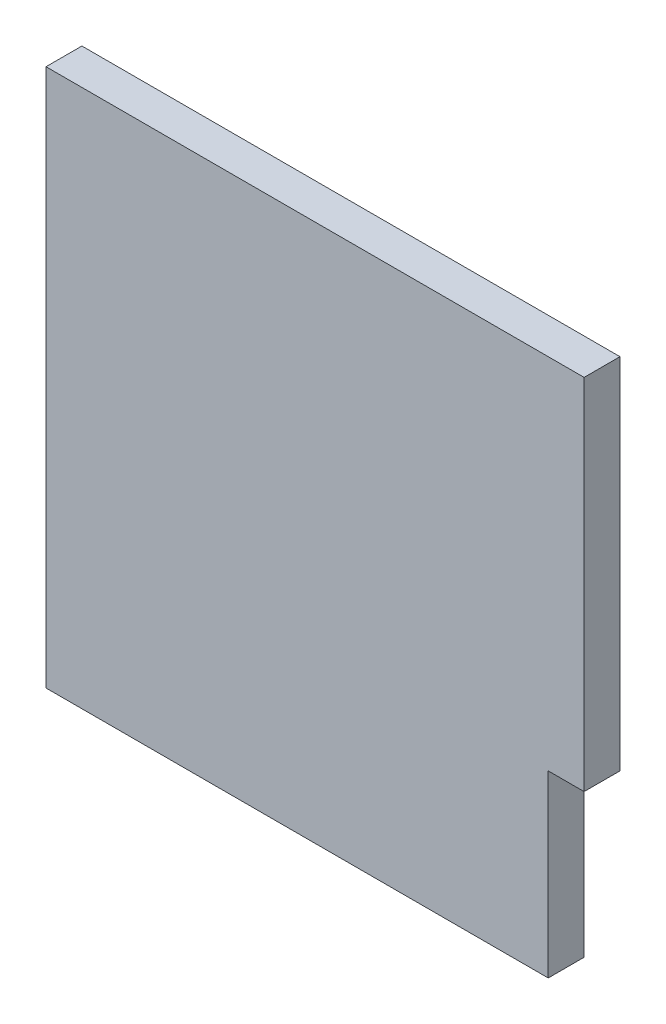
ISO-10303-21;
HEADER;
FILE_DESCRIPTION(('STEP AP214'),'2;1');
FILE_NAME('part.step','',(''),(''),'','','');
FILE_SCHEMA(('AUTOMOTIVE_DESIGN { 1 0 10303 214 1 1 1 1 }'));
ENDSEC;
DATA;
#1=APPLICATION_CONTEXT('core data for automotive mechanical design processes');
#2=APPLICATION_PROTOCOL_DEFINITION('international standard','automotive_design',2000,#1);
#3=PRODUCT_CONTEXT('',#1,'mechanical');
#4=PRODUCT('Part','Part','',(#3));
#5=PRODUCT_RELATED_PRODUCT_CATEGORY('part','',(#4));
#6=PRODUCT_DEFINITION_FORMATION('','',#4);
#7=PRODUCT_DEFINITION_CONTEXT('part definition',#1,'design');
#8=PRODUCT_DEFINITION('design','',#6,#7);
#9=PRODUCT_DEFINITION_SHAPE('','',#8);
#10=(LENGTH_UNIT() NAMED_UNIT(*) SI_UNIT(.MILLI.,.METRE.));
#11=(NAMED_UNIT(*) PLANE_ANGLE_UNIT() SI_UNIT($,.RADIAN.));
#12=(NAMED_UNIT(*) SI_UNIT($,.STERADIAN.) SOLID_ANGLE_UNIT());
#13=UNCERTAINTY_MEASURE_WITH_UNIT(LENGTH_MEASURE(1.E-05),#10,'distance_accuracy_value','');
#14=(GEOMETRIC_REPRESENTATION_CONTEXT(3) GLOBAL_UNCERTAINTY_ASSIGNED_CONTEXT((#13)) GLOBAL_UNIT_ASSIGNED_CONTEXT((#10,
#11,#12)) REPRESENTATION_CONTEXT('',''));
#15=CARTESIAN_POINT('',(0.,0.,0.));
#16=DIRECTION('',(0.,0.,1.));
#17=DIRECTION('',(1.,0.,0.));
#18=AXIS2_PLACEMENT_3D('',#15,#16,#17);
#19=CARTESIAN_POINT('',(-0.1,0.,0.05));
#20=DIRECTION('',(0.,1.,0.));
#21=DIRECTION('',(0.,0.,1.));
#22=AXIS2_PLACEMENT_3D('',#19,#20,#21);
#23=PLANE('',#22);
#24=DIRECTION('',(1.,0.,0.));
#25=VECTOR('',#24,1.);
#26=CARTESIAN_POINT('',(-0.1,0.,-0.05));
#27=LINE('',#26,#25);
#28=CARTESIAN_POINT('',(-0.1,0.,-0.05));
#29=VERTEX_POINT('',#28);
#30=CARTESIAN_POINT('',(0.,0.,-0.05));
#31=VERTEX_POINT('',#30);
#32=EDGE_CURVE('E128',#29,#31,#27,.T.);
#33=ORIENTED_EDGE('',*,*,#32,.T.);
#34=DIRECTION('',(0.,0.,-1.));
#35=VECTOR('',#34,1.);
#36=CARTESIAN_POINT('',(0.,0.,0.05));
#37=LINE('',#36,#35);
#38=CARTESIAN_POINT('',(0.,0.,0.05));
#39=VERTEX_POINT('',#38);
#40=EDGE_CURVE('E11',#39,#31,#37,.T.);
#41=ORIENTED_EDGE('',*,*,#40,.F.);
#42=DIRECTION('',(1.,0.,0.));
#43=VECTOR('',#42,1.);
#44=CARTESIAN_POINT('',(-0.1,0.,0.05));
#45=LINE('',#44,#43);
#46=CARTESIAN_POINT('',(-0.1,0.,0.05));
#47=VERTEX_POINT('',#46);
#48=EDGE_CURVE('E144',#47,#39,#45,.T.);
#49=ORIENTED_EDGE('',*,*,#48,.F.);
#50=DIRECTION('',(0.,0.,-1.));
#51=VECTOR('',#50,1.);
#52=CARTESIAN_POINT('',(-0.1,0.,0.05));
#53=LINE('',#52,#51);
#54=EDGE_CURVE('E124',#47,#29,#53,.T.);
#55=ORIENTED_EDGE('',*,*,#54,.T.);
#56=EDGE_LOOP('',(#33,#41,#49,#55));
#57=FACE_BOUND('',#56,.T.);
#58=ADVANCED_FACE('F39',(#57),#23,.F.);
#59=CARTESIAN_POINT('',(0.,0.,0.05));
#60=DIRECTION('',(-1.,0.,0.));
#61=DIRECTION('',(0.,0.,1.));
#62=AXIS2_PLACEMENT_3D('',#59,#60,#61);
#63=PLANE('',#62);
#64=DIRECTION('',(0.,1.,0.));
#65=VECTOR('',#64,1.);
#66=CARTESIAN_POINT('',(0.,0.,-0.05));
#67=LINE('',#66,#65);
#68=CARTESIAN_POINT('',(0.,1.,-0.05));
#69=VERTEX_POINT('',#68);
#70=EDGE_CURVE('E132',#31,#69,#67,.T.);
#71=ORIENTED_EDGE('',*,*,#70,.T.);
#72=DIRECTION('',(0.,0.,-1.));
#73=VECTOR('',#72,1.);
#74=CARTESIAN_POINT('',(0.,1.,0.05));
#75=LINE('',#74,#73);
#76=CARTESIAN_POINT('',(0.,1.,0.05));
#77=VERTEX_POINT('',#76);
#78=EDGE_CURVE('E48',#77,#69,#75,.T.);
#79=ORIENTED_EDGE('',*,*,#78,.F.);
#80=DIRECTION('',(0.,1.,0.));
#81=VECTOR('',#80,1.);
#82=CARTESIAN_POINT('',(0.,0.,0.05));
#83=LINE('',#82,#81);
#84=EDGE_CURVE('E93',#39,#77,#83,.T.);
#85=ORIENTED_EDGE('',*,*,#84,.F.);
#86=ORIENTED_EDGE('',*,*,#40,.T.);
#87=EDGE_LOOP('',(#71,#79,#85,#86));
#88=FACE_BOUND('',#87,.T.);
#89=ADVANCED_FACE('F172',(#88),#63,.F.);
#90=CARTESIAN_POINT('',(0.,1.,0.05));
#91=DIRECTION('',(0.,-1.,0.));
#92=DIRECTION('',(1.,0.,0.));
#93=AXIS2_PLACEMENT_3D('',#90,#91,#92);
#94=PLANE('',#93);
#95=DIRECTION('',(-1.,0.,0.));
#96=VECTOR('',#95,1.);
#97=CARTESIAN_POINT('',(0.,1.,-0.05));
#98=LINE('',#97,#96);
#99=CARTESIAN_POINT('',(-1.5,1.,-0.05));
#100=VERTEX_POINT('',#99);
#101=EDGE_CURVE('E135',#69,#100,#98,.T.);
#102=ORIENTED_EDGE('',*,*,#101,.T.);
#103=DIRECTION('',(0.,0.,-1.));
#104=VECTOR('',#103,1.);
#105=CARTESIAN_POINT('',(-1.5,1.,0.05));
#106=LINE('',#105,#104);
#107=CARTESIAN_POINT('',(-1.5,1.,0.05));
#108=VERTEX_POINT('',#107);
#109=EDGE_CURVE('E117',#108,#100,#106,.T.);
#110=ORIENTED_EDGE('',*,*,#109,.F.);
#111=DIRECTION('',(-1.,0.,0.));
#112=VECTOR('',#111,1.);
#113=CARTESIAN_POINT('',(0.,1.,0.05));
#114=LINE('',#113,#112);
#115=EDGE_CURVE('E106',#77,#108,#114,.T.);
#116=ORIENTED_EDGE('',*,*,#115,.F.);
#117=ORIENTED_EDGE('',*,*,#78,.T.);
#118=EDGE_LOOP('',(#102,#110,#116,#117));
#119=FACE_BOUND('',#118,.T.);
#120=ADVANCED_FACE('F154',(#119),#94,.F.);
#121=CARTESIAN_POINT('',(-1.5,1.,0.05));
#122=DIRECTION('',(1.,0.,0.));
#123=DIRECTION('',(0.,1.,0.));
#124=AXIS2_PLACEMENT_3D('',#121,#122,#123);
#125=PLANE('',#124);
#126=DIRECTION('',(0.,-1.,0.));
#127=VECTOR('',#126,1.);
#128=CARTESIAN_POINT('',(-1.5,1.,-0.05));
#129=LINE('',#128,#127);
#130=CARTESIAN_POINT('',(-1.5,-0.5,-0.05));
#131=VERTEX_POINT('',#130);
#132=EDGE_CURVE('E115',#100,#131,#129,.T.);
#133=ORIENTED_EDGE('',*,*,#132,.T.);
#134=DIRECTION('',(0.,0.,-1.));
#135=VECTOR('',#134,1.);
#136=CARTESIAN_POINT('',(-1.5,-0.5,0.05));
#137=LINE('',#136,#135);
#138=CARTESIAN_POINT('',(-1.5,-0.5,0.05));
#139=VERTEX_POINT('',#138);
#140=EDGE_CURVE('E112',#139,#131,#137,.T.);
#141=ORIENTED_EDGE('',*,*,#140,.F.);
#142=DIRECTION('',(0.,-1.,0.));
#143=VECTOR('',#142,1.);
#144=CARTESIAN_POINT('',(-1.5,1.,0.05));
#145=LINE('',#144,#143);
#146=EDGE_CURVE('E100',#108,#139,#145,.T.);
#147=ORIENTED_EDGE('',*,*,#146,.F.);
#148=ORIENTED_EDGE('',*,*,#109,.T.);
#149=EDGE_LOOP('',(#133,#141,#147,#148));
#150=FACE_BOUND('',#149,.T.);
#151=ADVANCED_FACE('F113',(#150),#125,.F.);
#152=CARTESIAN_POINT('',(-1.5,-0.5,0.05));
#153=DIRECTION('',(0.,1.,0.));
#154=DIRECTION('',(0.,0.,1.));
#155=AXIS2_PLACEMENT_3D('',#152,#153,#154);
#156=PLANE('',#155);
#157=DIRECTION('',(1.,0.,0.));
#158=VECTOR('',#157,1.);
#159=CARTESIAN_POINT('',(-1.5,-0.5,-0.05));
#160=LINE('',#159,#158);
#161=CARTESIAN_POINT('',(-0.1,-0.5,-0.05));
#162=VERTEX_POINT('',#161);
#163=EDGE_CURVE('E79',#131,#162,#160,.T.);
#164=ORIENTED_EDGE('',*,*,#163,.T.);
#165=DIRECTION('',(0.,0.,-1.));
#166=VECTOR('',#165,1.);
#167=CARTESIAN_POINT('',(-0.1,-0.5,0.05));
#168=LINE('',#167,#166);
#169=CARTESIAN_POINT('',(-0.1,-0.5,0.05));
#170=VERTEX_POINT('',#169);
#171=EDGE_CURVE('E118',#170,#162,#168,.T.);
#172=ORIENTED_EDGE('',*,*,#171,.F.);
#173=DIRECTION('',(1.,0.,0.));
#174=VECTOR('',#173,1.);
#175=CARTESIAN_POINT('',(-1.5,-0.5,0.05));
#176=LINE('',#175,#174);
#177=EDGE_CURVE('E104',#139,#170,#176,.T.);
#178=ORIENTED_EDGE('',*,*,#177,.F.);
#179=ORIENTED_EDGE('',*,*,#140,.T.);
#180=EDGE_LOOP('',(#164,#172,#178,#179));
#181=FACE_BOUND('',#180,.T.);
#182=ADVANCED_FACE('F120',(#181),#156,.F.);
#183=CARTESIAN_POINT('',(-0.1,-0.5,0.05));
#184=DIRECTION('',(-1.,0.,0.));
#185=DIRECTION('',(0.,-1.,0.));
#186=AXIS2_PLACEMENT_3D('',#183,#184,#185);
#187=PLANE('',#186);
#188=DIRECTION('',(0.,1.,0.));
#189=VECTOR('',#188,1.);
#190=CARTESIAN_POINT('',(-0.1,-0.5,-0.05));
#191=LINE('',#190,#189);
#192=EDGE_CURVE('E85',#162,#29,#191,.T.);
#193=ORIENTED_EDGE('',*,*,#192,.T.);
#194=ORIENTED_EDGE('',*,*,#54,.F.);
#195=DIRECTION('',(0.,1.,0.));
#196=VECTOR('',#195,1.);
#197=CARTESIAN_POINT('',(-0.1,-0.5,0.05));
#198=LINE('',#197,#196);
#199=EDGE_CURVE('E56',#170,#47,#198,.T.);
#200=ORIENTED_EDGE('',*,*,#199,.F.);
#201=ORIENTED_EDGE('',*,*,#171,.T.);
#202=EDGE_LOOP('',(#193,#194,#200,#201));
#203=FACE_BOUND('',#202,.T.);
#204=ADVANCED_FACE('F161',(#203),#187,.F.);
#205=CARTESIAN_POINT('',(0.,0.,0.05));
#206=DIRECTION('',(0.,0.,1.));
#207=DIRECTION('',(1.,0.,0.));
#208=AXIS2_PLACEMENT_3D('',#205,#206,#207);
#209=PLANE('',#208);
#210=ORIENTED_EDGE('',*,*,#48,.T.);
#211=ORIENTED_EDGE('',*,*,#84,.T.);
#212=ORIENTED_EDGE('',*,*,#115,.T.);
#213=ORIENTED_EDGE('',*,*,#146,.T.);
#214=ORIENTED_EDGE('',*,*,#177,.T.);
#215=ORIENTED_EDGE('',*,*,#199,.T.);
#216=EDGE_LOOP('',(#210,#211,#212,#213,#214,#215));
#217=FACE_BOUND('',#216,.T.);
#218=ADVANCED_FACE('F102',(#217),#209,.T.);
#219=CARTESIAN_POINT('',(0.,0.,-0.05));
#220=DIRECTION('',(0.,0.,1.));
#221=DIRECTION('',(1.,0.,0.));
#222=AXIS2_PLACEMENT_3D('',#219,#220,#221);
#223=PLANE('',#222);
#224=ORIENTED_EDGE('',*,*,#32,.F.);
#225=ORIENTED_EDGE('',*,*,#192,.F.);
#226=ORIENTED_EDGE('',*,*,#163,.F.);
#227=ORIENTED_EDGE('',*,*,#132,.F.);
#228=ORIENTED_EDGE('',*,*,#101,.F.);
#229=ORIENTED_EDGE('',*,*,#70,.F.);
#230=EDGE_LOOP('',(#224,#225,#226,#227,#228,#229));
#231=FACE_BOUND('',#230,.T.);
#232=ADVANCED_FACE('F157',(#231),#223,.F.);
#233=CLOSED_SHELL('',(#58,#89,#120,#151,#182,#204,#218,#232));
#234=MANIFOLD_SOLID_BREP('B2',#233);
#235=ADVANCED_BREP_SHAPE_REPRESENTATION('',(#18,#234),#14);
#236=SHAPE_DEFINITION_REPRESENTATION(#9,#235);
ENDSEC;
END-ISO-10303-21;
